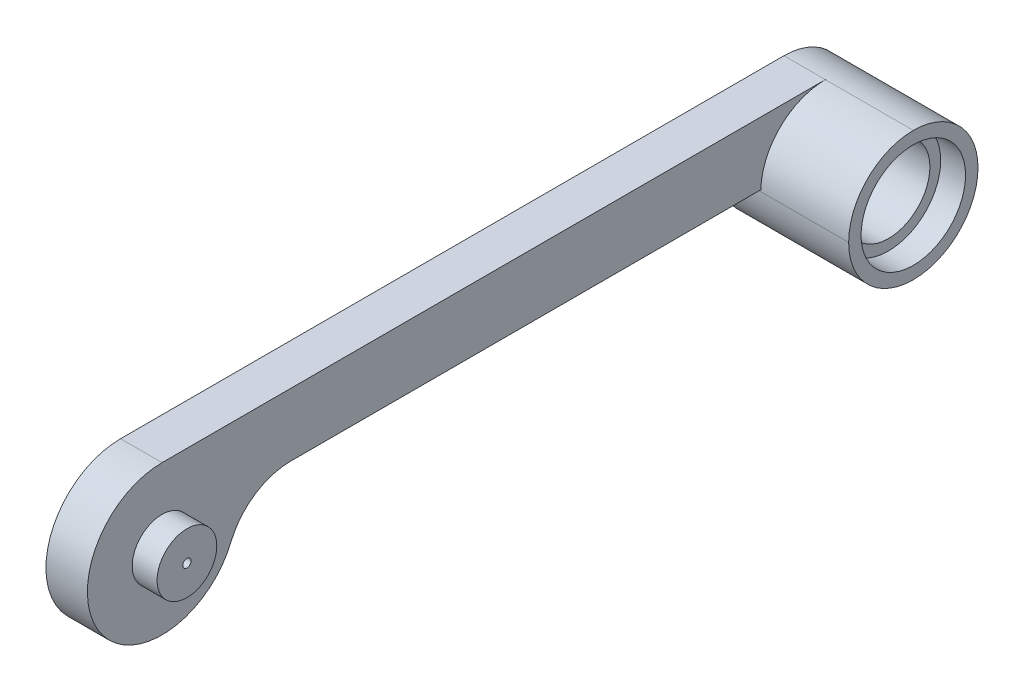
ISO-10303-21;
HEADER;
FILE_DESCRIPTION(('STEP AP214'),'2;1');
FILE_NAME('part.step','',(''),(''),'','','');
FILE_SCHEMA(('AUTOMOTIVE_DESIGN { 1 0 10303 214 1 1 1 1 }'));
ENDSEC;
DATA;
#1=APPLICATION_CONTEXT('core data for automotive mechanical design processes');
#2=APPLICATION_PROTOCOL_DEFINITION('international standard','automotive_design',2000,#1);
#3=PRODUCT_CONTEXT('',#1,'mechanical');
#4=PRODUCT('Part','Part','',(#3));
#5=PRODUCT_RELATED_PRODUCT_CATEGORY('part','',(#4));
#6=PRODUCT_DEFINITION_FORMATION('','',#4);
#7=PRODUCT_DEFINITION_CONTEXT('part definition',#1,'design');
#8=PRODUCT_DEFINITION('design','',#6,#7);
#9=PRODUCT_DEFINITION_SHAPE('','',#8);
#10=(LENGTH_UNIT() NAMED_UNIT(*) SI_UNIT(.MILLI.,.METRE.));
#11=(NAMED_UNIT(*) PLANE_ANGLE_UNIT() SI_UNIT($,.RADIAN.));
#12=(NAMED_UNIT(*) SI_UNIT($,.STERADIAN.) SOLID_ANGLE_UNIT());
#13=UNCERTAINTY_MEASURE_WITH_UNIT(LENGTH_MEASURE(1.E-05),#10,'distance_accuracy_value','');
#14=(GEOMETRIC_REPRESENTATION_CONTEXT(3) GLOBAL_UNCERTAINTY_ASSIGNED_CONTEXT((#13)) GLOBAL_UNIT_ASSIGNED_CONTEXT((#10,
#11,#12)) REPRESENTATION_CONTEXT('',''));
#15=CARTESIAN_POINT('',(0.,0.,0.));
#16=DIRECTION('',(0.,0.,1.));
#17=DIRECTION('',(1.,0.,0.));
#18=AXIS2_PLACEMENT_3D('',#15,#16,#17);
#19=CARTESIAN_POINT('',(7.8,-19.4,-40.));
#20=DIRECTION('',(-1.,0.,0.));
#21=DIRECTION('',(0.,0.,1.));
#22=AXIS2_PLACEMENT_3D('',#19,#20,#21);
#23=CYLINDRICAL_SURFACE('',#22,2.5);
#24=CARTESIAN_POINT('',(1.5,-19.4,-40.));
#25=DIRECTION('',(-1.,0.,0.));
#26=DIRECTION('',(0.,0.,-1.));
#27=AXIS2_PLACEMENT_3D('',#24,#25,#26);
#28=CIRCLE('',#27,2.5);
#29=CARTESIAN_POINT('',(1.5,-19.4,-42.5));
#30=VERTEX_POINT('',#29);
#31=EDGE_CURVE('E223',#30,#30,#28,.T.);
#32=ORIENTED_EDGE('',*,*,#31,.T.);
#33=EDGE_LOOP('',(#32));
#34=FACE_BOUND('',#33,.T.);
#35=CARTESIAN_POINT('',(6.3,-19.4,-40.));
#36=DIRECTION('',(-1.,0.,0.));
#37=DIRECTION('',(0.,0.,-1.));
#38=AXIS2_PLACEMENT_3D('',#35,#36,#37);
#39=CIRCLE('',#38,2.5);
#40=CARTESIAN_POINT('',(6.3,-19.4,-42.5));
#41=VERTEX_POINT('',#40);
#42=EDGE_CURVE('E211',#41,#41,#39,.T.);
#43=ORIENTED_EDGE('',*,*,#42,.F.);
#44=EDGE_LOOP('',(#43));
#45=FACE_BOUND('',#44,.T.);
#46=ADVANCED_FACE('F68',(#34,#45),#23,.F.);
#47=CARTESIAN_POINT('',(2.5,-20.,0.));
#48=DIRECTION('',(-1.,0.,0.));
#49=DIRECTION('',(0.,0.,1.));
#50=AXIS2_PLACEMENT_3D('',#47,#48,#49);
#51=CYLINDRICAL_SURFACE('',#50,4.5);
#52=CARTESIAN_POINT('',(2.5,-20.,0.));
#53=DIRECTION('',(-1.,0.,0.));
#54=DIRECTION('',(0.,0.,-1.));
#55=AXIS2_PLACEMENT_3D('',#52,#53,#54);
#56=CIRCLE('',#55,4.5);
#57=CARTESIAN_POINT('',(2.5,-21.7142857142857,-4.16067596548877));
#58=VERTEX_POINT('',#57);
#59=CARTESIAN_POINT('',(2.5,-15.5,0.));
#60=VERTEX_POINT('',#59);
#61=EDGE_CURVE('E161',#58,#60,#56,.T.);
#62=ORIENTED_EDGE('',*,*,#61,.T.);
#63=DIRECTION('',(-1.,0.,0.));
#64=VECTOR('',#63,1.);
#65=CARTESIAN_POINT('',(2.5,-15.5,0.));
#66=LINE('',#65,#64);
#67=CARTESIAN_POINT('',(0.,-15.5,0.));
#68=VERTEX_POINT('',#67);
#69=EDGE_CURVE('E142',#60,#68,#66,.T.);
#70=ORIENTED_EDGE('',*,*,#69,.T.);
#71=CARTESIAN_POINT('',(0.,-20.,0.));
#72=DIRECTION('',(-1.,0.,0.));
#73=DIRECTION('',(0.,0.,-1.));
#74=AXIS2_PLACEMENT_3D('',#71,#72,#73);
#75=CIRCLE('',#74,4.5);
#76=CARTESIAN_POINT('',(0.,-21.7142857142857,-4.16067596548877));
#77=VERTEX_POINT('',#76);
#78=EDGE_CURVE('E153',#77,#68,#75,.T.);
#79=ORIENTED_EDGE('',*,*,#78,.F.);
#80=DIRECTION('',(-1.,0.,0.));
#81=VECTOR('',#80,1.);
#82=CARTESIAN_POINT('',(2.5,-21.7142857142857,-4.16067596548877));
#83=LINE('',#82,#81);
#84=EDGE_CURVE('E168',#58,#77,#83,.T.);
#85=ORIENTED_EDGE('',*,*,#84,.F.);
#86=EDGE_LOOP('',(#62,#70,#79,#85));
#87=FACE_BOUND('',#86,.T.);
#88=ADVANCED_FACE('F163',(#87),#51,.T.);
#89=CARTESIAN_POINT('',(0.,-20.,0.));
#90=DIRECTION('',(1.,0.,0.));
#91=DIRECTION('',(0.,0.,-1.));
#92=AXIS2_PLACEMENT_3D('',#89,#90,#91);
#93=PLANE('',#92);
#94=CARTESIAN_POINT('',(0.,-19.4,-40.));
#95=DIRECTION('',(-1.,0.,0.));
#96=DIRECTION('',(0.,0.,-1.));
#97=AXIS2_PLACEMENT_3D('',#94,#95,#96);
#98=CIRCLE('',#97,3.15);
#99=CARTESIAN_POINT('',(0.,-19.4,-43.15));
#100=VERTEX_POINT('',#99);
#101=EDGE_CURVE('E220',#100,#100,#98,.T.);
#102=ORIENTED_EDGE('',*,*,#101,.F.);
#103=EDGE_LOOP('',(#102));
#104=FACE_BOUND('',#103,.T.);
#105=DIRECTION('',(0.,0.,1.));
#106=VECTOR('',#105,1.);
#107=CARTESIAN_POINT('',(0.,-19.3,0.));
#108=LINE('',#107,#106);
#109=CARTESIAN_POINT('',(0.,-19.3,-36.1012822620764));
#110=VERTEX_POINT('',#109);
#111=CARTESIAN_POINT('',(0.,-19.3,-7.76659513557904));
#112=VERTEX_POINT('',#111);
#113=EDGE_CURVE('E206',#110,#112,#108,.T.);
#114=ORIENTED_EDGE('',*,*,#113,.T.);
#115=CARTESIAN_POINT('',(0.,-23.2,-7.76659513557904));
#116=DIRECTION('',(-1.,0.,0.));
#117=DIRECTION('',(0.,0.,-1.));
#118=AXIS2_PLACEMENT_3D('',#115,#116,#117);
#119=CIRCLE('',#118,3.9);
#120=EDGE_CURVE('E157',#77,#112,#119,.T.);
#121=ORIENTED_EDGE('',*,*,#120,.F.);
#122=ORIENTED_EDGE('',*,*,#78,.T.);
#123=DIRECTION('',(0.,0.,-1.));
#124=VECTOR('',#123,1.);
#125=CARTESIAN_POINT('',(0.,-15.5,0.));
#126=LINE('',#125,#124);
#127=CARTESIAN_POINT('',(0.,-15.5,-40.));
#128=VERTEX_POINT('',#127);
#129=EDGE_CURVE('E137',#68,#128,#126,.T.);
#130=ORIENTED_EDGE('',*,*,#129,.T.);
#131=CARTESIAN_POINT('',(0.,-19.4,-40.));
#132=DIRECTION('',(-1.,0.,0.));
#133=DIRECTION('',(0.,0.,-1.));
#134=AXIS2_PLACEMENT_3D('',#131,#132,#133);
#135=CIRCLE('',#134,3.9);
#136=CARTESIAN_POINT('',(0.,-19.4,-43.9));
#137=VERTEX_POINT('',#136);
#138=EDGE_CURVE('E179',#137,#128,#135,.F.);
#139=ORIENTED_EDGE('',*,*,#138,.F.);
#140=CARTESIAN_POINT('',(0.,-19.4,-40.));
#141=DIRECTION('',(-1.,0.,0.));
#142=DIRECTION('',(0.,0.,-1.));
#143=AXIS2_PLACEMENT_3D('',#140,#141,#142);
#144=CIRCLE('',#143,3.9);
#145=CARTESIAN_POINT('',(0.,-23.3,-40.));
#146=VERTEX_POINT('',#145);
#147=EDGE_CURVE('E176',#146,#137,#144,.F.);
#148=ORIENTED_EDGE('',*,*,#147,.F.);
#149=CARTESIAN_POINT('',(0.,-19.4,-40.));
#150=DIRECTION('',(-1.,0.,0.));
#151=DIRECTION('',(0.,0.,-1.));
#152=AXIS2_PLACEMENT_3D('',#149,#150,#151);
#153=CIRCLE('',#152,3.9);
#154=CARTESIAN_POINT('',(0.,-19.4,-36.1));
#155=VERTEX_POINT('',#154);
#156=EDGE_CURVE('E181',#155,#146,#153,.F.);
#157=ORIENTED_EDGE('',*,*,#156,.F.);
#158=CARTESIAN_POINT('',(0.,-19.4,-40.));
#159=DIRECTION('',(-1.,0.,0.));
#160=DIRECTION('',(0.,0.,-1.));
#161=AXIS2_PLACEMENT_3D('',#158,#159,#160);
#162=CIRCLE('',#161,3.9);
#163=EDGE_CURVE('E183',#110,#155,#162,.F.);
#164=ORIENTED_EDGE('',*,*,#163,.F.);
#165=EDGE_LOOP('',(#114,#121,#122,#130,#139,#148,#157,#164));
#166=FACE_BOUND('',#165,.T.);
#167=ADVANCED_FACE('F155',(#104,#166),#93,.F.);
#168=CARTESIAN_POINT('',(2.5,-20.,0.));
#169=DIRECTION('',(1.,0.,0.));
#170=DIRECTION('',(0.,0.,-1.));
#171=AXIS2_PLACEMENT_3D('',#168,#169,#170);
#172=PLANE('',#171);
#173=DIRECTION('',(0.,0.,-1.));
#174=VECTOR('',#173,1.);
#175=CARTESIAN_POINT('',(2.5,-19.3,0.));
#176=LINE('',#175,#174);
#177=CARTESIAN_POINT('',(2.5,-19.3,-7.76659513557904));
#178=VERTEX_POINT('',#177);
#179=CARTESIAN_POINT('',(2.5,-19.3,-36.1012822620764));
#180=VERTEX_POINT('',#179);
#181=EDGE_CURVE('E207',#178,#180,#176,.T.);
#182=ORIENTED_EDGE('',*,*,#181,.T.);
#183=CARTESIAN_POINT('',(2.5,-19.4,-40.));
#184=DIRECTION('',(-1.,0.,0.));
#185=DIRECTION('',(0.,0.,-1.));
#186=AXIS2_PLACEMENT_3D('',#183,#184,#185);
#187=CIRCLE('',#186,3.9);
#188=CARTESIAN_POINT('',(2.5,-15.5,-40.));
#189=VERTEX_POINT('',#188);
#190=EDGE_CURVE('E77',#189,#180,#187,.F.);
#191=ORIENTED_EDGE('',*,*,#190,.F.);
#192=DIRECTION('',(0.,0.,-1.));
#193=VECTOR('',#192,1.);
#194=CARTESIAN_POINT('',(2.5,-15.5,0.));
#195=LINE('',#194,#193);
#196=EDGE_CURVE('E149',#60,#189,#195,.T.);
#197=ORIENTED_EDGE('',*,*,#196,.F.);
#198=ORIENTED_EDGE('',*,*,#61,.F.);
#199=CARTESIAN_POINT('',(2.5,-23.2,-7.76659513557904));
#200=DIRECTION('',(-1.,0.,0.));
#201=DIRECTION('',(0.,0.,-1.));
#202=AXIS2_PLACEMENT_3D('',#199,#200,#201);
#203=CIRCLE('',#202,3.9);
#204=EDGE_CURVE('E198',#178,#58,#203,.F.);
#205=ORIENTED_EDGE('',*,*,#204,.F.);
#206=EDGE_LOOP('',(#182,#191,#197,#198,#205));
#207=FACE_BOUND('',#206,.T.);
#208=CARTESIAN_POINT('',(2.5,-20.,0.));
#209=DIRECTION('',(-1.,0.,0.));
#210=DIRECTION('',(0.,0.,-1.));
#211=AXIS2_PLACEMENT_3D('',#208,#209,#210);
#212=CIRCLE('',#211,1.8);
#213=CARTESIAN_POINT('',(2.5,-20.,-1.8));
#214=VERTEX_POINT('',#213);
#215=EDGE_CURVE('E234',#214,#214,#212,.T.);
#216=ORIENTED_EDGE('',*,*,#215,.T.);
#217=EDGE_LOOP('',(#216));
#218=FACE_BOUND('',#217,.T.);
#219=ADVANCED_FACE('F240',(#207,#218),#172,.T.);
#220=CARTESIAN_POINT('',(2.5,-15.5,0.));
#221=DIRECTION('',(0.,-1.,0.));
#222=DIRECTION('',(0.,0.,1.));
#223=AXIS2_PLACEMENT_3D('',#220,#221,#222);
#224=PLANE('',#223);
#225=DIRECTION('',(-1.,0.,0.));
#226=VECTOR('',#225,1.);
#227=CARTESIAN_POINT('',(2.5,-15.5,-40.));
#228=LINE('',#227,#226);
#229=EDGE_CURVE('E145',#128,#189,#228,.F.);
#230=ORIENTED_EDGE('',*,*,#229,.F.);
#231=ORIENTED_EDGE('',*,*,#129,.F.);
#232=ORIENTED_EDGE('',*,*,#69,.F.);
#233=ORIENTED_EDGE('',*,*,#196,.T.);
#234=EDGE_LOOP('',(#230,#231,#232,#233));
#235=FACE_BOUND('',#234,.T.);
#236=ADVANCED_FACE('F139',(#235),#224,.F.);
#237=CARTESIAN_POINT('',(4.,-20.,0.));
#238=DIRECTION('',(1.,0.,0.));
#239=DIRECTION('',(0.,0.,-1.));
#240=AXIS2_PLACEMENT_3D('',#237,#238,#239);
#241=PLANE('',#240);
#242=CARTESIAN_POINT('',(4.,-20.,0.));
#243=DIRECTION('',(-1.,0.,0.));
#244=DIRECTION('',(0.,0.,-1.));
#245=AXIS2_PLACEMENT_3D('',#242,#243,#244);
#246=CIRCLE('',#245,1.8);
#247=CARTESIAN_POINT('',(4.,-20.,-1.8));
#248=VERTEX_POINT('',#247);
#249=EDGE_CURVE('E150',#248,#248,#246,.T.);
#250=ORIENTED_EDGE('',*,*,#249,.F.);
#251=EDGE_LOOP('',(#250));
#252=FACE_BOUND('',#251,.T.);
#253=CARTESIAN_POINT('',(4.,-20.,0.));
#254=DIRECTION('',(-1.,0.,0.));
#255=DIRECTION('',(0.,0.,-1.));
#256=AXIS2_PLACEMENT_3D('',#253,#254,#255);
#257=CIRCLE('',#256,0.25);
#258=CARTESIAN_POINT('',(4.,-20.,-0.25));
#259=VERTEX_POINT('',#258);
#260=EDGE_CURVE('E229',#259,#259,#257,.T.);
#261=ORIENTED_EDGE('',*,*,#260,.T.);
#262=EDGE_LOOP('',(#261));
#263=FACE_BOUND('',#262,.T.);
#264=ADVANCED_FACE('F245',(#252,#263),#241,.T.);
#265=CARTESIAN_POINT('',(4.,-20.,0.));
#266=DIRECTION('',(-1.,0.,0.));
#267=DIRECTION('',(0.,0.,1.));
#268=AXIS2_PLACEMENT_3D('',#265,#266,#267);
#269=CYLINDRICAL_SURFACE('',#268,1.8);
#270=ORIENTED_EDGE('',*,*,#249,.T.);
#271=EDGE_LOOP('',(#270));
#272=FACE_BOUND('',#271,.T.);
#273=ORIENTED_EDGE('',*,*,#215,.F.);
#274=EDGE_LOOP('',(#273));
#275=FACE_BOUND('',#274,.T.);
#276=ADVANCED_FACE('F242',(#272,#275),#269,.T.);
#277=CARTESIAN_POINT('',(4.,-20.,0.));
#278=DIRECTION('',(-1.,0.,0.));
#279=DIRECTION('',(0.,0.,1.));
#280=AXIS2_PLACEMENT_3D('',#277,#278,#279);
#281=CYLINDRICAL_SURFACE('',#280,0.25);
#282=ORIENTED_EDGE('',*,*,#260,.F.);
#283=EDGE_LOOP('',(#282));
#284=FACE_BOUND('',#283,.T.);
#285=CARTESIAN_POINT('',(2.5,-20.,0.));
#286=DIRECTION('',(-1.,0.,0.));
#287=DIRECTION('',(0.,0.,-1.));
#288=AXIS2_PLACEMENT_3D('',#285,#286,#287);
#289=CIRCLE('',#288,0.25);
#290=CARTESIAN_POINT('',(2.5,-20.,-0.25));
#291=VERTEX_POINT('',#290);
#292=EDGE_CURVE('E165',#291,#291,#289,.F.);
#293=ORIENTED_EDGE('',*,*,#292,.F.);
#294=EDGE_LOOP('',(#293));
#295=FACE_BOUND('',#294,.T.);
#296=ADVANCED_FACE('F244',(#284,#295),#281,.F.);
#297=ORIENTED_EDGE('',*,*,#292,.T.);
#298=EDGE_LOOP('',(#297));
#299=FACE_BOUND('',#298,.T.);
#300=ADVANCED_FACE('F252',(#299),#172,.T.);
#301=CARTESIAN_POINT('',(7.8,-20.,0.));
#302=DIRECTION('',(1.,0.,0.));
#303=DIRECTION('',(0.,0.,-1.));
#304=AXIS2_PLACEMENT_3D('',#301,#302,#303);
#305=PLANE('',#304);
#306=CARTESIAN_POINT('',(7.8,-19.4,-40.));
#307=DIRECTION('',(-1.,0.,0.));
#308=DIRECTION('',(0.,0.,-1.));
#309=AXIS2_PLACEMENT_3D('',#306,#307,#308);
#310=CIRCLE('',#309,3.15);
#311=CARTESIAN_POINT('',(7.8,-19.4,-43.15));
#312=VERTEX_POINT('',#311);
#313=EDGE_CURVE('E216',#312,#312,#310,.T.);
#314=ORIENTED_EDGE('',*,*,#313,.T.);
#315=EDGE_LOOP('',(#314));
#316=FACE_BOUND('',#315,.T.);
#317=CARTESIAN_POINT('',(7.8,-19.4,-40.));
#318=DIRECTION('',(-1.,0.,0.));
#319=DIRECTION('',(0.,0.,-1.));
#320=AXIS2_PLACEMENT_3D('',#317,#318,#319);
#321=CIRCLE('',#320,3.9);
#322=CARTESIAN_POINT('',(7.8,-23.3,-40.));
#323=VERTEX_POINT('',#322);
#324=CARTESIAN_POINT('',(7.8,-19.4,-36.1));
#325=VERTEX_POINT('',#324);
#326=EDGE_CURVE('E192',#323,#325,#321,.T.);
#327=ORIENTED_EDGE('',*,*,#326,.F.);
#328=CARTESIAN_POINT('',(7.8,-19.4,-40.));
#329=DIRECTION('',(-1.,0.,0.));
#330=DIRECTION('',(0.,0.,-1.));
#331=AXIS2_PLACEMENT_3D('',#328,#329,#330);
#332=CIRCLE('',#331,3.9);
#333=CARTESIAN_POINT('',(7.8,-19.4,-43.9));
#334=VERTEX_POINT('',#333);
#335=EDGE_CURVE('E187',#334,#323,#332,.T.);
#336=ORIENTED_EDGE('',*,*,#335,.F.);
#337=CARTESIAN_POINT('',(7.8,-19.4,-40.));
#338=DIRECTION('',(-1.,0.,0.));
#339=DIRECTION('',(0.,0.,-1.));
#340=AXIS2_PLACEMENT_3D('',#337,#338,#339);
#341=CIRCLE('',#340,3.9);
#342=CARTESIAN_POINT('',(7.8,-15.5,-40.));
#343=VERTEX_POINT('',#342);
#344=EDGE_CURVE('E189',#343,#334,#341,.T.);
#345=ORIENTED_EDGE('',*,*,#344,.F.);
#346=CARTESIAN_POINT('',(7.8,-19.4,-40.));
#347=DIRECTION('',(-1.,0.,0.));
#348=DIRECTION('',(0.,0.,-1.));
#349=AXIS2_PLACEMENT_3D('',#346,#347,#348);
#350=CIRCLE('',#349,3.9);
#351=EDGE_CURVE('E194',#325,#343,#350,.T.);
#352=ORIENTED_EDGE('',*,*,#351,.F.);
#353=EDGE_LOOP('',(#327,#336,#345,#352));
#354=FACE_BOUND('',#353,.T.);
#355=ADVANCED_FACE('F270',(#316,#354),#305,.T.);
#356=CARTESIAN_POINT('',(1.5,-19.4,-40.));
#357=DIRECTION('',(-1.,0.,0.));
#358=DIRECTION('',(0.,0.,1.));
#359=AXIS2_PLACEMENT_3D('',#356,#357,#358);
#360=CYLINDRICAL_SURFACE('',#359,3.15);
#361=CARTESIAN_POINT('',(1.5,-19.4,-40.));
#362=DIRECTION('',(-1.,0.,0.));
#363=DIRECTION('',(0.,0.,-1.));
#364=AXIS2_PLACEMENT_3D('',#361,#362,#363);
#365=CIRCLE('',#364,3.15);
#366=CARTESIAN_POINT('',(1.5,-19.4,-43.15));
#367=VERTEX_POINT('',#366);
#368=EDGE_CURVE('E226',#367,#367,#365,.T.);
#369=ORIENTED_EDGE('',*,*,#368,.F.);
#370=EDGE_LOOP('',(#369));
#371=FACE_BOUND('',#370,.T.);
#372=ORIENTED_EDGE('',*,*,#101,.T.);
#373=EDGE_LOOP('',(#372));
#374=FACE_BOUND('',#373,.T.);
#375=ADVANCED_FACE('F268',(#371,#374),#360,.F.);
#376=CARTESIAN_POINT('',(1.5,-20.,0.));
#377=DIRECTION('',(1.,0.,0.));
#378=DIRECTION('',(0.,0.,-1.));
#379=AXIS2_PLACEMENT_3D('',#376,#377,#378);
#380=PLANE('',#379);
#381=ORIENTED_EDGE('',*,*,#31,.F.);
#382=EDGE_LOOP('',(#381));
#383=FACE_BOUND('',#382,.T.);
#384=ORIENTED_EDGE('',*,*,#368,.T.);
#385=EDGE_LOOP('',(#384));
#386=FACE_BOUND('',#385,.T.);
#387=ADVANCED_FACE('F277',(#383,#386),#380,.F.);
#388=CARTESIAN_POINT('',(6.3,-19.4,-40.));
#389=DIRECTION('',(1.,0.,0.));
#390=DIRECTION('',(0.,0.,-1.));
#391=AXIS2_PLACEMENT_3D('',#388,#389,#390);
#392=CYLINDRICAL_SURFACE('',#391,3.15);
#393=CARTESIAN_POINT('',(6.3,-19.4,-40.));
#394=DIRECTION('',(-1.,0.,0.));
#395=DIRECTION('',(0.,0.,-1.));
#396=AXIS2_PLACEMENT_3D('',#393,#394,#395);
#397=CIRCLE('',#396,3.15);
#398=CARTESIAN_POINT('',(6.3,-19.4,-43.15));
#399=VERTEX_POINT('',#398);
#400=EDGE_CURVE('E217',#399,#399,#397,.T.);
#401=ORIENTED_EDGE('',*,*,#400,.T.);
#402=EDGE_LOOP('',(#401));
#403=FACE_BOUND('',#402,.T.);
#404=ORIENTED_EDGE('',*,*,#313,.F.);
#405=EDGE_LOOP('',(#404));
#406=FACE_BOUND('',#405,.T.);
#407=ADVANCED_FACE('F397',(#403,#406),#392,.F.);
#408=CARTESIAN_POINT('',(6.3,-19.4,-40.));
#409=DIRECTION('',(1.,0.,0.));
#410=DIRECTION('',(0.,0.,-1.));
#411=AXIS2_PLACEMENT_3D('',#408,#409,#410);
#412=PLANE('',#411);
#413=ORIENTED_EDGE('',*,*,#42,.T.);
#414=EDGE_LOOP('',(#413));
#415=FACE_BOUND('',#414,.T.);
#416=ORIENTED_EDGE('',*,*,#400,.F.);
#417=EDGE_LOOP('',(#416));
#418=FACE_BOUND('',#417,.T.);
#419=ADVANCED_FACE('F304',(#415,#418),#412,.T.);
#420=CARTESIAN_POINT('',(7.8,-19.3,0.));
#421=DIRECTION('',(0.,1.,0.));
#422=DIRECTION('',(0.,0.,-1.));
#423=AXIS2_PLACEMENT_3D('',#420,#421,#422);
#424=PLANE('',#423);
#425=ORIENTED_EDGE('',*,*,#113,.F.);
#426=DIRECTION('',(1.,0.,0.));
#427=VECTOR('',#426,1.);
#428=CARTESIAN_POINT('',(2.5,-19.3,-36.1012822620764));
#429=LINE('',#428,#427);
#430=EDGE_CURVE('E12',#180,#110,#429,.F.);
#431=ORIENTED_EDGE('',*,*,#430,.F.);
#432=ORIENTED_EDGE('',*,*,#181,.F.);
#433=DIRECTION('',(1.,0.,0.));
#434=VECTOR('',#433,1.);
#435=CARTESIAN_POINT('',(2.5,-19.3,-7.76659513557904));
#436=LINE('',#435,#434);
#437=EDGE_CURVE('E174',#112,#178,#436,.T.);
#438=ORIENTED_EDGE('',*,*,#437,.F.);
#439=EDGE_LOOP('',(#425,#431,#432,#438));
#440=FACE_BOUND('',#439,.T.);
#441=ADVANCED_FACE('F298',(#440),#424,.F.);
#442=CARTESIAN_POINT('',(2.5,-23.2,-7.76659513557904));
#443=DIRECTION('',(-1.,0.,0.));
#444=DIRECTION('',(0.,0.,1.));
#445=AXIS2_PLACEMENT_3D('',#442,#443,#444);
#446=CYLINDRICAL_SURFACE('',#445,3.9);
#447=ORIENTED_EDGE('',*,*,#204,.T.);
#448=ORIENTED_EDGE('',*,*,#84,.T.);
#449=ORIENTED_EDGE('',*,*,#120,.T.);
#450=ORIENTED_EDGE('',*,*,#437,.T.);
#451=EDGE_LOOP('',(#447,#448,#449,#450));
#452=FACE_BOUND('',#451,.T.);
#453=ADVANCED_FACE('F292',(#452),#446,.F.);
#454=CARTESIAN_POINT('',(2.5,-19.4,-40.));
#455=DIRECTION('',(1.,0.,0.));
#456=DIRECTION('',(0.,0.,-1.));
#457=AXIS2_PLACEMENT_3D('',#454,#455,#456);
#458=CYLINDRICAL_SURFACE('',#457,3.9);
#459=DIRECTION('',(-1.,0.,0.));
#460=VECTOR('',#459,1.);
#461=CARTESIAN_POINT('',(7.8,-19.4,-43.9));
#462=LINE('',#461,#460);
#463=EDGE_CURVE('E204',#137,#334,#462,.F.);
#464=ORIENTED_EDGE('',*,*,#463,.T.);
#465=ORIENTED_EDGE('',*,*,#335,.T.);
#466=DIRECTION('',(-1.,0.,0.));
#467=VECTOR('',#466,1.);
#468=CARTESIAN_POINT('',(0.,-23.3,-40.));
#469=LINE('',#468,#467);
#470=EDGE_CURVE('E72',#323,#146,#469,.T.);
#471=ORIENTED_EDGE('',*,*,#470,.T.);
#472=ORIENTED_EDGE('',*,*,#147,.T.);
#473=EDGE_LOOP('',(#464,#465,#471,#472));
#474=FACE_BOUND('',#473,.T.);
#475=ADVANCED_FACE('F70',(#474),#458,.T.);
#476=CARTESIAN_POINT('',(7.8,-19.4,-40.));
#477=DIRECTION('',(-1.,0.,0.));
#478=DIRECTION('',(0.,0.,1.));
#479=AXIS2_PLACEMENT_3D('',#476,#477,#478);
#480=CYLINDRICAL_SURFACE('',#479,3.9);
#481=ORIENTED_EDGE('',*,*,#470,.F.);
#482=ORIENTED_EDGE('',*,*,#326,.T.);
#483=DIRECTION('',(-1.,0.,0.));
#484=VECTOR('',#483,1.);
#485=CARTESIAN_POINT('',(7.8,-19.4,-36.1));
#486=LINE('',#485,#484);
#487=EDGE_CURVE('E203',#325,#155,#486,.T.);
#488=ORIENTED_EDGE('',*,*,#487,.T.);
#489=ORIENTED_EDGE('',*,*,#156,.T.);
#490=EDGE_LOOP('',(#481,#482,#488,#489));
#491=FACE_BOUND('',#490,.T.);
#492=ADVANCED_FACE('F286',(#491),#480,.T.);
#493=CARTESIAN_POINT('',(2.5,-19.4,-40.));
#494=DIRECTION('',(-1.,0.,0.));
#495=DIRECTION('',(0.,0.,1.));
#496=AXIS2_PLACEMENT_3D('',#493,#494,#495);
#497=CYLINDRICAL_SURFACE('',#496,3.9);
#498=ORIENTED_EDGE('',*,*,#463,.F.);
#499=ORIENTED_EDGE('',*,*,#138,.T.);
#500=ORIENTED_EDGE('',*,*,#229,.T.);
#501=DIRECTION('',(-1.,0.,0.));
#502=VECTOR('',#501,1.);
#503=CARTESIAN_POINT('',(2.5,-15.5,-40.));
#504=LINE('',#503,#502);
#505=EDGE_CURVE('E201',#189,#343,#504,.F.);
#506=ORIENTED_EDGE('',*,*,#505,.T.);
#507=ORIENTED_EDGE('',*,*,#344,.T.);
#508=EDGE_LOOP('',(#498,#499,#500,#506,#507));
#509=FACE_BOUND('',#508,.T.);
#510=ADVANCED_FACE('F297',(#509),#497,.T.);
#511=CARTESIAN_POINT('',(2.5,-19.4,-40.));
#512=DIRECTION('',(1.,0.,0.));
#513=DIRECTION('',(0.,0.,-1.));
#514=AXIS2_PLACEMENT_3D('',#511,#512,#513);
#515=CYLINDRICAL_SURFACE('',#514,3.9);
#516=ORIENTED_EDGE('',*,*,#351,.T.);
#517=ORIENTED_EDGE('',*,*,#505,.F.);
#518=ORIENTED_EDGE('',*,*,#190,.T.);
#519=ORIENTED_EDGE('',*,*,#430,.T.);
#520=ORIENTED_EDGE('',*,*,#163,.T.);
#521=ORIENTED_EDGE('',*,*,#487,.F.);
#522=EDGE_LOOP('',(#516,#517,#518,#519,#520,#521));
#523=FACE_BOUND('',#522,.T.);
#524=ADVANCED_FACE('F290',(#523),#515,.T.);
#525=CLOSED_SHELL('',(#46,#88,#167,#219,#236,#264,#276,#296,#300,#355,#375,#387,#407,#419,#441,
#453,#475,#492,#510,#524));
#526=MANIFOLD_SOLID_BREP('B2',#525);
#527=ADVANCED_BREP_SHAPE_REPRESENTATION('',(#18,#526),#14);
#528=SHAPE_DEFINITION_REPRESENTATION(#9,#527);
ENDSEC;
END-ISO-10303-21;
